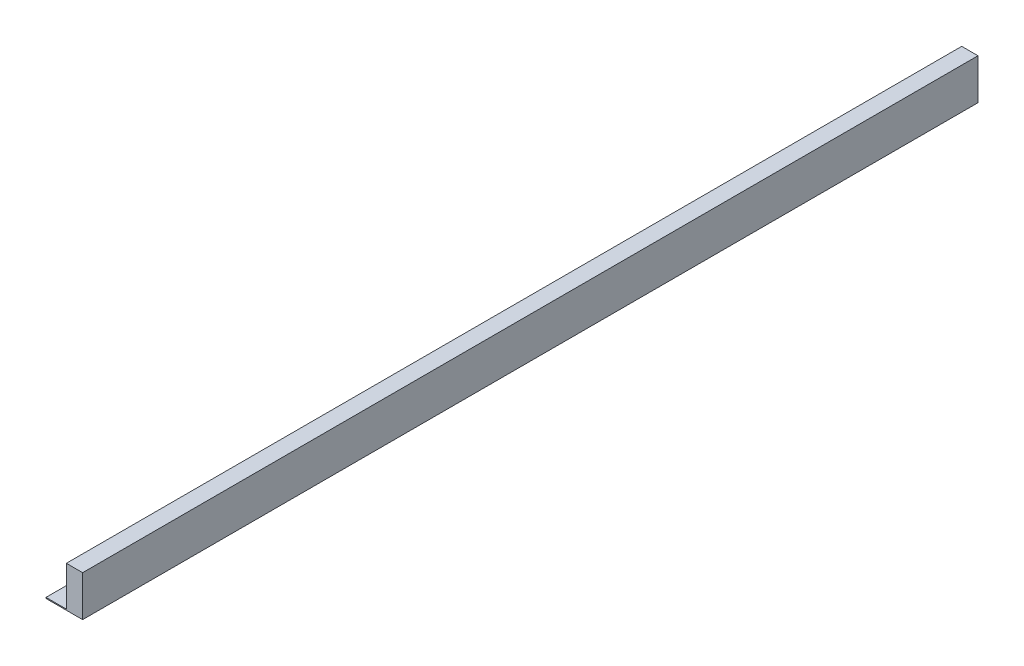
ISO-10303-21;
HEADER;
FILE_DESCRIPTION(('STEP AP214'),'2;1');
FILE_NAME('part.step','',(''),(''),'','','');
FILE_SCHEMA(('AUTOMOTIVE_DESIGN { 1 0 10303 214 1 1 1 1 }'));
ENDSEC;
DATA;
#1=APPLICATION_CONTEXT('core data for automotive mechanical design processes');
#2=APPLICATION_PROTOCOL_DEFINITION('international standard','automotive_design',2000,#1);
#3=PRODUCT_CONTEXT('',#1,'mechanical');
#4=PRODUCT('Part','Part','',(#3));
#5=PRODUCT_RELATED_PRODUCT_CATEGORY('part','',(#4));
#6=PRODUCT_DEFINITION_FORMATION('','',#4);
#7=PRODUCT_DEFINITION_CONTEXT('part definition',#1,'design');
#8=PRODUCT_DEFINITION('design','',#6,#7);
#9=PRODUCT_DEFINITION_SHAPE('','',#8);
#10=(LENGTH_UNIT() NAMED_UNIT(*) SI_UNIT(.MILLI.,.METRE.));
#11=(NAMED_UNIT(*) PLANE_ANGLE_UNIT() SI_UNIT($,.RADIAN.));
#12=(NAMED_UNIT(*) SI_UNIT($,.STERADIAN.) SOLID_ANGLE_UNIT());
#13=UNCERTAINTY_MEASURE_WITH_UNIT(LENGTH_MEASURE(1.E-05),#10,'distance_accuracy_value','');
#14=(GEOMETRIC_REPRESENTATION_CONTEXT(3) GLOBAL_UNCERTAINTY_ASSIGNED_CONTEXT((#13)) GLOBAL_UNIT_ASSIGNED_CONTEXT((#10,
#11,#12)) REPRESENTATION_CONTEXT('',''));
#15=CARTESIAN_POINT('',(0.,0.,0.));
#16=DIRECTION('',(0.,0.,1.));
#17=DIRECTION('',(1.,0.,0.));
#18=AXIS2_PLACEMENT_3D('',#15,#16,#17);
#19=CARTESIAN_POINT('',(-6.35,-15.24,558.8));
#20=DIRECTION('',(1.,0.,0.));
#21=DIRECTION('',(0.,0.,-1.));
#22=AXIS2_PLACEMENT_3D('',#19,#20,#21);
#23=PLANE('',#22);
#24=DIRECTION('',(0.,0.,-1.));
#25=VECTOR('',#24,1.);
#26=CARTESIAN_POINT('',(-6.34999999999999,-12.065,571.515865090508));
#27=LINE('',#26,#25);
#28=CARTESIAN_POINT('',(-6.35,-12.065,558.8));
#29=VERTEX_POINT('',#28);
#30=CARTESIAN_POINT('',(-6.34999999999999,-12.065,0.));
#31=VERTEX_POINT('',#30);
#32=EDGE_CURVE('E51',#29,#31,#27,.T.);
#33=ORIENTED_EDGE('',*,*,#32,.F.);
#34=DIRECTION('',(0.,-1.,0.));
#35=VECTOR('',#34,1.);
#36=CARTESIAN_POINT('',(-6.35,-15.24,558.8));
#37=LINE('',#36,#35);
#38=CARTESIAN_POINT('',(-6.35,12.7,558.8));
#39=VERTEX_POINT('',#38);
#40=EDGE_CURVE('E12',#39,#29,#37,.T.);
#41=ORIENTED_EDGE('',*,*,#40,.F.);
#42=DIRECTION('',(0.,0.,1.));
#43=VECTOR('',#42,1.);
#44=CARTESIAN_POINT('',(-6.35,12.7,0.));
#45=LINE('',#44,#43);
#46=CARTESIAN_POINT('',(-6.35,12.7,0.));
#47=VERTEX_POINT('',#46);
#48=EDGE_CURVE('E89',#47,#39,#45,.T.);
#49=ORIENTED_EDGE('',*,*,#48,.F.);
#50=DIRECTION('',(0.,-1.,0.));
#51=VECTOR('',#50,1.);
#52=CARTESIAN_POINT('',(-6.35,-15.24,0.));
#53=LINE('',#52,#51);
#54=EDGE_CURVE('E40',#47,#31,#53,.T.);
#55=ORIENTED_EDGE('',*,*,#54,.T.);
#56=EDGE_LOOP('',(#33,#41,#49,#55));
#57=FACE_BOUND('',#56,.T.);
#58=ADVANCED_FACE('F37',(#57),#23,.F.);
#59=CARTESIAN_POINT('',(0.,0.,558.8));
#60=DIRECTION('',(0.,0.,-1.));
#61=DIRECTION('',(-1.,0.,0.));
#62=AXIS2_PLACEMENT_3D('',#59,#60,#61);
#63=PLANE('',#62);
#64=DIRECTION('',(-1.,0.,0.));
#65=VECTOR('',#64,1.);
#66=CARTESIAN_POINT('',(-6.35,12.7,558.8));
#67=LINE('',#66,#65);
#68=CARTESIAN_POINT('',(3.81,12.7,558.8));
#69=VERTEX_POINT('',#68);
#70=EDGE_CURVE('E119',#69,#39,#67,.T.);
#71=ORIENTED_EDGE('',*,*,#70,.T.);
#72=ORIENTED_EDGE('',*,*,#40,.T.);
#73=DIRECTION('',(1.,0.,0.));
#74=VECTOR('',#73,1.);
#75=CARTESIAN_POINT('',(-6.34999999999999,-12.065,558.8));
#76=LINE('',#75,#74);
#77=CARTESIAN_POINT('',(-19.05,-12.065,558.8));
#78=VERTEX_POINT('',#77);
#79=EDGE_CURVE('E100',#78,#29,#76,.T.);
#80=ORIENTED_EDGE('',*,*,#79,.F.);
#81=DIRECTION('',(0.,1.,0.));
#82=VECTOR('',#81,1.);
#83=CARTESIAN_POINT('',(-19.05,-12.7,558.8));
#84=LINE('',#83,#82);
#85=CARTESIAN_POINT('',(-19.05,-12.7,558.8));
#86=VERTEX_POINT('',#85);
#87=EDGE_CURVE('E101',#86,#78,#84,.T.);
#88=ORIENTED_EDGE('',*,*,#87,.F.);
#89=DIRECTION('',(1.,0.,0.));
#90=VECTOR('',#89,1.);
#91=CARTESIAN_POINT('',(-6.34999999999999,-12.7,558.8));
#92=LINE('',#91,#90);
#93=CARTESIAN_POINT('',(3.81000000000001,-12.7,558.8));
#94=VERTEX_POINT('',#93);
#95=EDGE_CURVE('E123',#86,#94,#92,.T.);
#96=ORIENTED_EDGE('',*,*,#95,.T.);
#97=DIRECTION('',(0.,1.,0.));
#98=VECTOR('',#97,1.);
#99=CARTESIAN_POINT('',(3.81,12.7,558.8));
#100=LINE('',#99,#98);
#101=EDGE_CURVE('E126',#94,#69,#100,.T.);
#102=ORIENTED_EDGE('',*,*,#101,.T.);
#103=EDGE_LOOP('',(#71,#72,#80,#88,#96,#102));
#104=FACE_BOUND('',#103,.T.);
#105=ADVANCED_FACE('F141',(#104),#63,.F.);
#106=CARTESIAN_POINT('',(0.,0.,0.));
#107=DIRECTION('',(0.,0.,-1.));
#108=DIRECTION('',(-1.,0.,0.));
#109=AXIS2_PLACEMENT_3D('',#106,#107,#108);
#110=PLANE('',#109);
#111=ORIENTED_EDGE('',*,*,#54,.F.);
#112=DIRECTION('',(-1.,0.,0.));
#113=VECTOR('',#112,1.);
#114=CARTESIAN_POINT('',(-6.35,12.7,0.));
#115=LINE('',#114,#113);
#116=CARTESIAN_POINT('',(3.81,12.7,0.));
#117=VERTEX_POINT('',#116);
#118=EDGE_CURVE('E121',#117,#47,#115,.T.);
#119=ORIENTED_EDGE('',*,*,#118,.F.);
#120=DIRECTION('',(0.,1.,0.));
#121=VECTOR('',#120,1.);
#122=CARTESIAN_POINT('',(3.81,12.7,0.));
#123=LINE('',#122,#121);
#124=CARTESIAN_POINT('',(3.81000000000001,-12.7,0.));
#125=VERTEX_POINT('',#124);
#126=EDGE_CURVE('E118',#125,#117,#123,.T.);
#127=ORIENTED_EDGE('',*,*,#126,.F.);
#128=DIRECTION('',(1.,0.,0.));
#129=VECTOR('',#128,1.);
#130=CARTESIAN_POINT('',(-6.34999999999999,-12.7,0.));
#131=LINE('',#130,#129);
#132=CARTESIAN_POINT('',(-19.05,-12.7,0.));
#133=VERTEX_POINT('',#132);
#134=EDGE_CURVE('E116',#133,#125,#131,.T.);
#135=ORIENTED_EDGE('',*,*,#134,.F.);
#136=DIRECTION('',(0.,-1.,0.));
#137=VECTOR('',#136,1.);
#138=CARTESIAN_POINT('',(-19.05,-12.7,0.));
#139=LINE('',#138,#137);
#140=CARTESIAN_POINT('',(-19.05,-12.065,0.));
#141=VERTEX_POINT('',#140);
#142=EDGE_CURVE('E106',#141,#133,#139,.T.);
#143=ORIENTED_EDGE('',*,*,#142,.F.);
#144=DIRECTION('',(-1.,0.,0.));
#145=VECTOR('',#144,1.);
#146=CARTESIAN_POINT('',(-6.34999999999999,-12.065,0.));
#147=LINE('',#146,#145);
#148=EDGE_CURVE('E98',#31,#141,#147,.T.);
#149=ORIENTED_EDGE('',*,*,#148,.F.);
#150=EDGE_LOOP('',(#111,#119,#127,#135,#143,#149));
#151=FACE_BOUND('',#150,.T.);
#152=ADVANCED_FACE('F104',(#151),#110,.T.);
#153=CARTESIAN_POINT('',(-6.35,12.7,0.));
#154=DIRECTION('',(0.,1.,0.));
#155=DIRECTION('',(0.,0.,1.));
#156=AXIS2_PLACEMENT_3D('',#153,#154,#155);
#157=PLANE('',#156);
#158=ORIENTED_EDGE('',*,*,#70,.F.);
#159=DIRECTION('',(0.,0.,1.));
#160=VECTOR('',#159,1.);
#161=CARTESIAN_POINT('',(3.81,12.7,0.));
#162=LINE('',#161,#160);
#163=EDGE_CURVE('E132',#117,#69,#162,.T.);
#164=ORIENTED_EDGE('',*,*,#163,.F.);
#165=ORIENTED_EDGE('',*,*,#118,.T.);
#166=ORIENTED_EDGE('',*,*,#48,.T.);
#167=EDGE_LOOP('',(#158,#164,#165,#166));
#168=FACE_BOUND('',#167,.T.);
#169=ADVANCED_FACE('F162',(#168),#157,.T.);
#170=CARTESIAN_POINT('',(3.81,12.7,0.));
#171=DIRECTION('',(1.,0.,0.));
#172=DIRECTION('',(0.,1.,0.));
#173=AXIS2_PLACEMENT_3D('',#170,#171,#172);
#174=PLANE('',#173);
#175=ORIENTED_EDGE('',*,*,#101,.F.);
#176=DIRECTION('',(0.,0.,1.));
#177=VECTOR('',#176,1.);
#178=CARTESIAN_POINT('',(3.81000000000001,-12.7,0.));
#179=LINE('',#178,#177);
#180=EDGE_CURVE('E58',#125,#94,#179,.T.);
#181=ORIENTED_EDGE('',*,*,#180,.F.);
#182=ORIENTED_EDGE('',*,*,#126,.T.);
#183=ORIENTED_EDGE('',*,*,#163,.T.);
#184=EDGE_LOOP('',(#175,#181,#182,#183));
#185=FACE_BOUND('',#184,.T.);
#186=ADVANCED_FACE('F138',(#185),#174,.T.);
#187=CARTESIAN_POINT('',(-6.34999999999999,-12.7,0.));
#188=DIRECTION('',(0.,-1.,0.));
#189=DIRECTION('',(0.,0.,-1.));
#190=AXIS2_PLACEMENT_3D('',#187,#188,#189);
#191=PLANE('',#190);
#192=ORIENTED_EDGE('',*,*,#95,.F.);
#193=DIRECTION('',(0.,0.,-1.));
#194=VECTOR('',#193,1.);
#195=CARTESIAN_POINT('',(-19.05,-12.7,571.515865090508));
#196=LINE('',#195,#194);
#197=EDGE_CURVE('E108',#86,#133,#196,.T.);
#198=ORIENTED_EDGE('',*,*,#197,.T.);
#199=ORIENTED_EDGE('',*,*,#134,.T.);
#200=ORIENTED_EDGE('',*,*,#180,.T.);
#201=EDGE_LOOP('',(#192,#198,#199,#200));
#202=FACE_BOUND('',#201,.T.);
#203=ADVANCED_FACE('F135',(#202),#191,.T.);
#204=CARTESIAN_POINT('',(-19.05,-12.7,571.515865090508));
#205=DIRECTION('',(1.,0.,0.));
#206=DIRECTION('',(0.,0.,-1.));
#207=AXIS2_PLACEMENT_3D('',#204,#205,#206);
#208=PLANE('',#207);
#209=ORIENTED_EDGE('',*,*,#197,.F.);
#210=ORIENTED_EDGE('',*,*,#87,.T.);
#211=DIRECTION('',(0.,0.,-1.));
#212=VECTOR('',#211,1.);
#213=CARTESIAN_POINT('',(-19.05,-12.065,571.515865090508));
#214=LINE('',#213,#212);
#215=EDGE_CURVE('E102',#78,#141,#214,.T.);
#216=ORIENTED_EDGE('',*,*,#215,.T.);
#217=ORIENTED_EDGE('',*,*,#142,.T.);
#218=EDGE_LOOP('',(#209,#210,#216,#217));
#219=FACE_BOUND('',#218,.T.);
#220=ADVANCED_FACE('F145',(#219),#208,.F.);
#221=CARTESIAN_POINT('',(-6.34999999999999,-12.065,571.515865090508));
#222=DIRECTION('',(0.,-1.,0.));
#223=DIRECTION('',(1.,0.,0.));
#224=AXIS2_PLACEMENT_3D('',#221,#222,#223);
#225=PLANE('',#224);
#226=ORIENTED_EDGE('',*,*,#215,.F.);
#227=ORIENTED_EDGE('',*,*,#79,.T.);
#228=ORIENTED_EDGE('',*,*,#32,.T.);
#229=ORIENTED_EDGE('',*,*,#148,.T.);
#230=EDGE_LOOP('',(#226,#227,#228,#229));
#231=FACE_BOUND('',#230,.T.);
#232=ADVANCED_FACE('F97',(#231),#225,.F.);
#233=CLOSED_SHELL('',(#58,#105,#152,#169,#186,#203,#220,#232));
#234=MANIFOLD_SOLID_BREP('B2',#233);
#235=ADVANCED_BREP_SHAPE_REPRESENTATION('',(#18,#234),#14);
#236=SHAPE_DEFINITION_REPRESENTATION(#9,#235);
ENDSEC;
END-ISO-10303-21;
